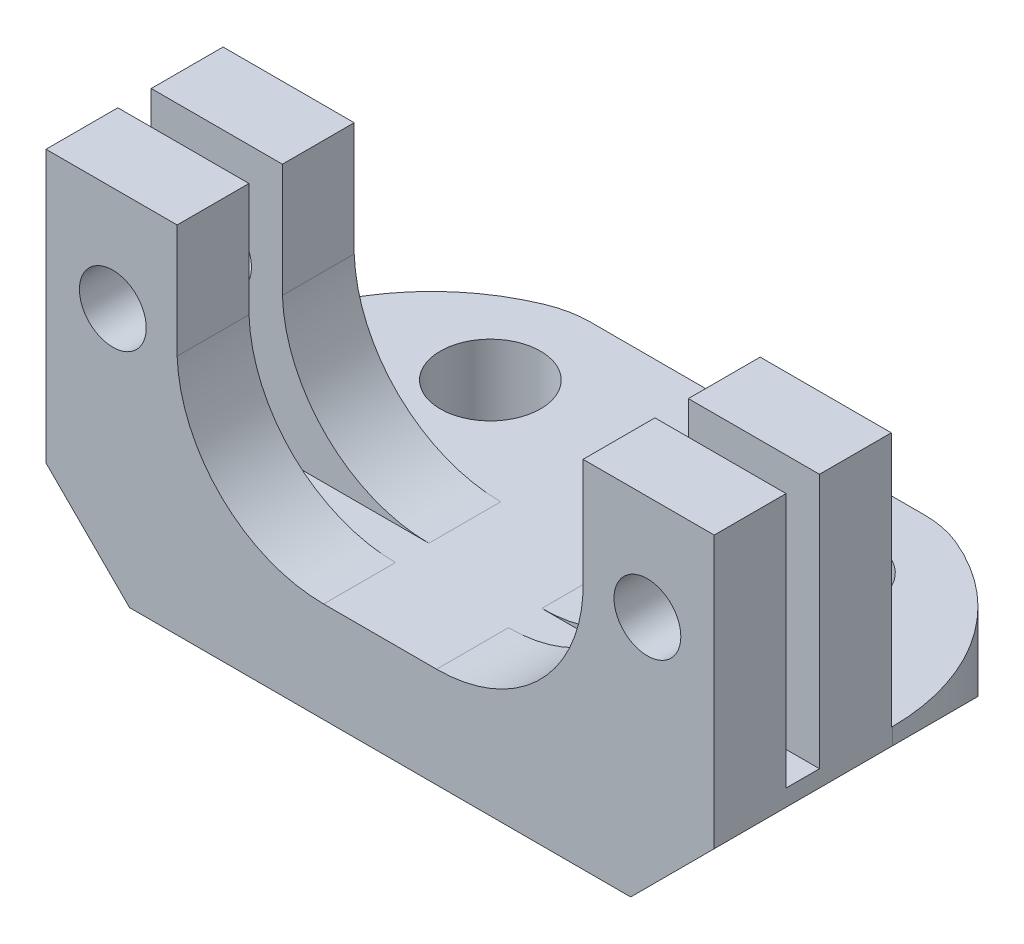
ISO-10303-21;
HEADER;
FILE_DESCRIPTION(('STEP AP214'),'2;1');
FILE_NAME('part.step','',(''),(''),'','','');
FILE_SCHEMA(('AUTOMOTIVE_DESIGN { 1 0 10303 214 1 1 1 1 }'));
ENDSEC;
DATA;
#1=APPLICATION_CONTEXT('core data for automotive mechanical design processes');
#2=APPLICATION_PROTOCOL_DEFINITION('international standard','automotive_design',2000,#1);
#3=PRODUCT_CONTEXT('',#1,'mechanical');
#4=PRODUCT('Part','Part','',(#3));
#5=PRODUCT_RELATED_PRODUCT_CATEGORY('part','',(#4));
#6=PRODUCT_DEFINITION_FORMATION('','',#4);
#7=PRODUCT_DEFINITION_CONTEXT('part definition',#1,'design');
#8=PRODUCT_DEFINITION('design','',#6,#7);
#9=PRODUCT_DEFINITION_SHAPE('','',#8);
#10=(LENGTH_UNIT() NAMED_UNIT(*) SI_UNIT(.MILLI.,.METRE.));
#11=(NAMED_UNIT(*) PLANE_ANGLE_UNIT() SI_UNIT($,.RADIAN.));
#12=(NAMED_UNIT(*) SI_UNIT($,.STERADIAN.) SOLID_ANGLE_UNIT());
#13=UNCERTAINTY_MEASURE_WITH_UNIT(LENGTH_MEASURE(1.E-05),#10,'distance_accuracy_value','');
#14=(GEOMETRIC_REPRESENTATION_CONTEXT(3) GLOBAL_UNCERTAINTY_ASSIGNED_CONTEXT((#13)) GLOBAL_UNIT_ASSIGNED_CONTEXT((#10,
#11,#12)) REPRESENTATION_CONTEXT('',''));
#15=CARTESIAN_POINT('',(0.,0.,0.));
#16=DIRECTION('',(0.,0.,1.));
#17=DIRECTION('',(1.,0.,0.));
#18=AXIS2_PLACEMENT_3D('',#15,#16,#17);
#19=CARTESIAN_POINT('',(-10.,10.6321180984836,5.3));
#20=DIRECTION('',(1.,0.,0.));
#21=DIRECTION('',(0.,0.,-1.));
#22=AXIS2_PLACEMENT_3D('',#19,#20,#21);
#23=PLANE('',#22);
#24=DIRECTION('',(0.,1.,0.));
#25=VECTOR('',#24,1.);
#26=CARTESIAN_POINT('',(-10.,0.,-0.0310658483845676));
#27=LINE('',#26,#25);
#28=CARTESIAN_POINT('',(-10.,2.5,-0.0310658483845676));
#29=VERTEX_POINT('',#28);
#30=CARTESIAN_POINT('',(-10.,3.,-0.0310658483845676));
#31=VERTEX_POINT('',#30);
#32=EDGE_CURVE('E237',#29,#31,#27,.T.);
#33=ORIENTED_EDGE('',*,*,#32,.F.);
#34=DIRECTION('',(0.,0.,-1.));
#35=VECTOR('',#34,1.);
#36=CARTESIAN_POINT('',(-10.,2.5,5.3));
#37=LINE('',#36,#35);
#38=CARTESIAN_POINT('',(-10.,2.5,5.3));
#39=VERTEX_POINT('',#38);
#40=EDGE_CURVE('E396',#39,#29,#37,.T.);
#41=ORIENTED_EDGE('',*,*,#40,.F.);
#42=DIRECTION('',(0.,-1.,0.));
#43=VECTOR('',#42,1.);
#44=CARTESIAN_POINT('',(-10.,10.6321180984836,5.3));
#45=LINE('',#44,#43);
#46=CARTESIAN_POINT('',(-10.,10.6321180984836,5.3));
#47=VERTEX_POINT('',#46);
#48=EDGE_CURVE('E393',#47,#39,#45,.T.);
#49=ORIENTED_EDGE('',*,*,#48,.F.);
#50=DIRECTION('',(0.,0.,-1.));
#51=VECTOR('',#50,1.);
#52=CARTESIAN_POINT('',(-10.,10.6321180984836,5.3));
#53=LINE('',#52,#51);
#54=CARTESIAN_POINT('',(-10.,10.6321180984836,3.15));
#55=VERTEX_POINT('',#54);
#56=EDGE_CURVE('E423',#47,#55,#53,.T.);
#57=ORIENTED_EDGE('',*,*,#56,.T.);
#58=DIRECTION('',(0.,-1.,0.));
#59=VECTOR('',#58,1.);
#60=CARTESIAN_POINT('',(-10.,3.,3.15));
#61=LINE('',#60,#59);
#62=CARTESIAN_POINT('',(-10.,3.,3.15));
#63=VERTEX_POINT('',#62);
#64=EDGE_CURVE('E299',#55,#63,#61,.T.);
#65=ORIENTED_EDGE('',*,*,#64,.T.);
#66=DIRECTION('',(0.,0.,-1.));
#67=VECTOR('',#66,1.);
#68=CARTESIAN_POINT('',(-10.,3.,3.15));
#69=LINE('',#68,#67);
#70=CARTESIAN_POINT('',(-10.,3.,2.15));
#71=VERTEX_POINT('',#70);
#72=EDGE_CURVE('E298',#63,#71,#69,.T.);
#73=ORIENTED_EDGE('',*,*,#72,.T.);
#74=DIRECTION('',(0.,1.,0.));
#75=VECTOR('',#74,1.);
#76=CARTESIAN_POINT('',(-10.,3.,2.15));
#77=LINE('',#76,#75);
#78=CARTESIAN_POINT('',(-10.,10.6321180984836,2.15));
#79=VERTEX_POINT('',#78);
#80=EDGE_CURVE('E302',#71,#79,#77,.T.);
#81=ORIENTED_EDGE('',*,*,#80,.T.);
#82=CARTESIAN_POINT('',(-10.,10.6321180984836,0.));
#83=VERTEX_POINT('',#82);
#84=EDGE_CURVE('E419',#79,#83,#53,.T.);
#85=ORIENTED_EDGE('',*,*,#84,.T.);
#86=DIRECTION('',(0.,-1.,0.));
#87=VECTOR('',#86,1.);
#88=CARTESIAN_POINT('',(-10.,10.6321180984836,0.));
#89=LINE('',#88,#87);
#90=CARTESIAN_POINT('',(-10.,3.,0.));
#91=VERTEX_POINT('',#90);
#92=EDGE_CURVE('E372',#83,#91,#89,.T.);
#93=ORIENTED_EDGE('',*,*,#92,.T.);
#94=DIRECTION('',(0.,0.,1.));
#95=VECTOR('',#94,1.);
#96=CARTESIAN_POINT('',(-10.,3.,-6.));
#97=LINE('',#96,#95);
#98=EDGE_CURVE('E291',#31,#91,#97,.T.);
#99=ORIENTED_EDGE('',*,*,#98,.F.);
#100=EDGE_LOOP('',(#33,#41,#49,#57,#65,#73,#81,#85,#93,#99));
#101=FACE_BOUND('',#100,.T.);
#102=ADVANCED_FACE('F39',(#101),#23,.F.);
#103=CARTESIAN_POINT('',(-7.50000000000003,0.,5.3));
#104=DIRECTION('',(0.,1.,0.));
#105=DIRECTION('',(0.,0.,1.));
#106=AXIS2_PLACEMENT_3D('',#103,#104,#105);
#107=PLANE('',#106);
#108=CARTESIAN_POINT('',(-5.,0.,-3.));
#109=DIRECTION('',(0.,1.,0.));
#110=DIRECTION('',(0.,0.,1.));
#111=AXIS2_PLACEMENT_3D('',#108,#109,#110);
#112=CIRCLE('',#111,1.5);
#113=CARTESIAN_POINT('',(-5.,0.,-1.5));
#114=VERTEX_POINT('',#113);
#115=EDGE_CURVE('E273',#114,#114,#112,.T.);
#116=ORIENTED_EDGE('',*,*,#115,.T.);
#117=EDGE_LOOP('',(#116));
#118=FACE_BOUND('',#117,.T.);
#119=CARTESIAN_POINT('',(5.,0.,-3.));
#120=DIRECTION('',(0.,1.,0.));
#121=DIRECTION('',(0.,0.,-1.));
#122=AXIS2_PLACEMENT_3D('',#119,#120,#121);
#123=CIRCLE('',#122,1.5);
#124=CARTESIAN_POINT('',(5.,0.,-4.5));
#125=VERTEX_POINT('',#124);
#126=EDGE_CURVE('E272',#125,#125,#123,.T.);
#127=ORIENTED_EDGE('',*,*,#126,.T.);
#128=EDGE_LOOP('',(#127));
#129=FACE_BOUND('',#128,.T.);
#130=CARTESIAN_POINT('',(-5.,0.,-3.));
#131=DIRECTION('',(0.,1.,0.));
#132=DIRECTION('',(0.,0.,1.));
#133=AXIS2_PLACEMENT_3D('',#130,#131,#132);
#134=CIRCLE('',#133,3.);
#135=CARTESIAN_POINT('',(-5.,0.,-6.));
#136=VERTEX_POINT('',#135);
#137=CARTESIAN_POINT('',(-6.14052533008233,0.,-5.77474358661131));
#138=VERTEX_POINT('',#137);
#139=EDGE_CURVE('E226',#136,#138,#134,.T.);
#140=ORIENTED_EDGE('',*,*,#139,.F.);
#141=DIRECTION('',(-1.,0.,0.));
#142=VECTOR('',#141,1.);
#143=CARTESIAN_POINT('',(0.,0.,-6.));
#144=LINE('',#143,#142);
#145=CARTESIAN_POINT('',(5.,0.,-6.));
#146=VERTEX_POINT('',#145);
#147=EDGE_CURVE('E287',#146,#136,#144,.T.);
#148=ORIENTED_EDGE('',*,*,#147,.F.);
#149=CARTESIAN_POINT('',(5.,0.,-3.));
#150=DIRECTION('',(0.,1.,0.));
#151=DIRECTION('',(0.,0.,1.));
#152=AXIS2_PLACEMENT_3D('',#149,#150,#151);
#153=CIRCLE('',#152,3.);
#154=CARTESIAN_POINT('',(6.14052533008233,0.,-5.77474358661131));
#155=VERTEX_POINT('',#154);
#156=EDGE_CURVE('E260',#155,#146,#153,.T.);
#157=ORIENTED_EDGE('',*,*,#156,.F.);
#158=CARTESIAN_POINT('',(3.77327032552495,0.,-0.0155329241923099));
#159=DIRECTION('',(0.,1.,0.));
#160=DIRECTION('',(0.,0.,1.));
#161=AXIS2_PLACEMENT_3D('',#158,#159,#160);
#162=CIRCLE('',#161,6.22674904831748);
#163=CARTESIAN_POINT('',(7.50000000000003,0.,-5.00390837559024));
#164=VERTEX_POINT('',#163);
#165=EDGE_CURVE('E254',#164,#155,#162,.T.);
#166=ORIENTED_EDGE('',*,*,#165,.F.);
#167=DIRECTION('',(0.,0.,-1.));
#168=VECTOR('',#167,1.);
#169=CARTESIAN_POINT('',(7.50000000000003,0.,5.3));
#170=LINE('',#169,#168);
#171=CARTESIAN_POINT('',(7.50000000000003,0.,5.3));
#172=VERTEX_POINT('',#171);
#173=EDGE_CURVE('E454',#172,#164,#170,.T.);
#174=ORIENTED_EDGE('',*,*,#173,.F.);
#175=DIRECTION('',(1.,0.,0.));
#176=VECTOR('',#175,1.);
#177=CARTESIAN_POINT('',(-7.50000000000003,0.,5.3));
#178=LINE('',#177,#176);
#179=CARTESIAN_POINT('',(-7.50000000000003,0.,5.3));
#180=VERTEX_POINT('',#179);
#181=EDGE_CURVE('E373',#180,#172,#178,.T.);
#182=ORIENTED_EDGE('',*,*,#181,.F.);
#183=DIRECTION('',(0.,0.,-1.));
#184=VECTOR('',#183,1.);
#185=CARTESIAN_POINT('',(-7.50000000000003,0.,5.3));
#186=LINE('',#185,#184);
#187=CARTESIAN_POINT('',(-7.50000000000003,0.,-5.00390837559024));
#188=VERTEX_POINT('',#187);
#189=EDGE_CURVE('E48',#180,#188,#186,.T.);
#190=ORIENTED_EDGE('',*,*,#189,.T.);
#191=CARTESIAN_POINT('',(-3.77327032552495,0.,-0.0155329241923099));
#192=DIRECTION('',(0.,1.,0.));
#193=DIRECTION('',(0.,0.,1.));
#194=AXIS2_PLACEMENT_3D('',#191,#192,#193);
#195=CIRCLE('',#194,6.22674904831748);
#196=EDGE_CURVE('E60',#188,#138,#195,.F.);
#197=ORIENTED_EDGE('',*,*,#196,.T.);
#198=EDGE_LOOP('',(#140,#148,#157,#166,#174,#182,#190,#197));
#199=FACE_BOUND('',#198,.T.);
#200=ADVANCED_FACE('F243',(#118,#129,#199),#107,.F.);
#201=CARTESIAN_POINT('',(7.50000000000003,0.,5.3));
#202=DIRECTION('',(-0.707106781186549,0.707106781186546,0.));
#203=DIRECTION('',(-0.707106781186546,-0.707106781186549,0.));
#204=AXIS2_PLACEMENT_3D('',#201,#202,#203);
#205=PLANE('',#204);
#206=CARTESIAN_POINT('',(3.77327032552495,-3.72672967447509,-0.0155329241923099));
#207=DIRECTION('',(-0.707106781186549,0.707106781186546,0.));
#208=DIRECTION('',(0.707106781186546,0.707106781186549,0.));
#209=AXIS2_PLACEMENT_3D('',#206,#207,#208);
#210=ELLIPSE('',#209,8.80595295362435,6.22674904831748);
#211=CARTESIAN_POINT('',(10.,2.50000000000001,-0.0310658483869174));
#212=VERTEX_POINT('',#211);
#213=EDGE_CURVE('E252',#212,#164,#210,.T.);
#214=ORIENTED_EDGE('',*,*,#213,.F.);
#215=DIRECTION('',(0.,0.,-1.));
#216=VECTOR('',#215,1.);
#217=CARTESIAN_POINT('',(10.,2.50000000000001,5.3));
#218=LINE('',#217,#216);
#219=CARTESIAN_POINT('',(10.,2.50000000000001,5.3));
#220=VERTEX_POINT('',#219);
#221=EDGE_CURVE('E455',#220,#212,#218,.T.);
#222=ORIENTED_EDGE('',*,*,#221,.F.);
#223=DIRECTION('',(0.707106781186546,0.707106781186549,0.));
#224=VECTOR('',#223,1.);
#225=CARTESIAN_POINT('',(7.50000000000003,0.,5.3));
#226=LINE('',#225,#224);
#227=EDGE_CURVE('E376',#172,#220,#226,.T.);
#228=ORIENTED_EDGE('',*,*,#227,.F.);
#229=ORIENTED_EDGE('',*,*,#173,.T.);
#230=EDGE_LOOP('',(#214,#222,#228,#229));
#231=FACE_BOUND('',#230,.T.);
#232=ADVANCED_FACE('F568',(#231),#205,.F.);
#233=CARTESIAN_POINT('',(1.68949167081497,3.,5.3));
#234=DIRECTION('',(0.,-1.,0.));
#235=DIRECTION('',(0.,0.,-1.));
#236=AXIS2_PLACEMENT_3D('',#233,#234,#235);
#237=PLANE('',#236);
#238=CARTESIAN_POINT('',(5.,3.,-3.));
#239=DIRECTION('',(0.,1.,0.));
#240=DIRECTION('',(0.,0.,-1.));
#241=AXIS2_PLACEMENT_3D('',#238,#239,#240);
#242=CIRCLE('',#241,1.5);
#243=CARTESIAN_POINT('',(5.,3.,-4.5));
#244=VERTEX_POINT('',#243);
#245=EDGE_CURVE('E278',#244,#244,#242,.T.);
#246=ORIENTED_EDGE('',*,*,#245,.F.);
#247=EDGE_LOOP('',(#246));
#248=FACE_BOUND('',#247,.T.);
#249=CARTESIAN_POINT('',(-5.,3.,-3.));
#250=DIRECTION('',(0.,1.,0.));
#251=DIRECTION('',(0.,0.,1.));
#252=AXIS2_PLACEMENT_3D('',#249,#250,#251);
#253=CIRCLE('',#252,1.5);
#254=CARTESIAN_POINT('',(-5.,3.,-1.5));
#255=VERTEX_POINT('',#254);
#256=EDGE_CURVE('E280',#255,#255,#253,.T.);
#257=ORIENTED_EDGE('',*,*,#256,.F.);
#258=EDGE_LOOP('',(#257));
#259=FACE_BOUND('',#258,.T.);
#260=CARTESIAN_POINT('',(-3.77327032552495,3.,-0.0155329241923099));
#261=DIRECTION('',(0.,1.,0.));
#262=DIRECTION('',(0.,0.,1.));
#263=AXIS2_PLACEMENT_3D('',#260,#261,#262);
#264=CIRCLE('',#263,6.22674904831748);
#265=CARTESIAN_POINT('',(-6.14052533008233,3.,-5.77474358661131));
#266=VERTEX_POINT('',#265);
#267=EDGE_CURVE('E238',#31,#266,#264,.F.);
#268=ORIENTED_EDGE('',*,*,#267,.F.);
#269=ORIENTED_EDGE('',*,*,#98,.T.);
#270=DIRECTION('',(1.,0.,0.));
#271=VECTOR('',#270,1.);
#272=CARTESIAN_POINT('',(0.,3.,0.));
#273=LINE('',#272,#271);
#274=CARTESIAN_POINT('',(-1.68945881939903,3.,0.));
#275=VERTEX_POINT('',#274);
#276=EDGE_CURVE('E49',#91,#275,#273,.T.);
#277=ORIENTED_EDGE('',*,*,#276,.T.);
#278=DIRECTION('',(0.,0.,-1.));
#279=VECTOR('',#278,1.);
#280=CARTESIAN_POINT('',(-1.68945881939903,3.,5.3));
#281=LINE('',#280,#279);
#282=CARTESIAN_POINT('',(-1.68945881939904,3.,2.15));
#283=VERTEX_POINT('',#282);
#284=EDGE_CURVE('E435',#283,#275,#281,.T.);
#285=ORIENTED_EDGE('',*,*,#284,.F.);
#286=DIRECTION('',(1.,0.,0.));
#287=VECTOR('',#286,1.);
#288=CARTESIAN_POINT('',(-10.,3.,2.15));
#289=LINE('',#288,#287);
#290=EDGE_CURVE('E321',#71,#283,#289,.T.);
#291=ORIENTED_EDGE('',*,*,#290,.F.);
#292=ORIENTED_EDGE('',*,*,#72,.F.);
#293=DIRECTION('',(1.,0.,0.));
#294=VECTOR('',#293,1.);
#295=CARTESIAN_POINT('',(-10.,3.,3.15));
#296=LINE('',#295,#294);
#297=CARTESIAN_POINT('',(-1.68945881939904,3.,3.15));
#298=VERTEX_POINT('',#297);
#299=EDGE_CURVE('E322',#63,#298,#296,.T.);
#300=ORIENTED_EDGE('',*,*,#299,.T.);
#301=CARTESIAN_POINT('',(-1.68945881939903,3.,5.3));
#302=VERTEX_POINT('',#301);
#303=EDGE_CURVE('E433',#302,#298,#281,.T.);
#304=ORIENTED_EDGE('',*,*,#303,.F.);
#305=DIRECTION('',(-1.,0.,0.));
#306=VECTOR('',#305,1.);
#307=CARTESIAN_POINT('',(1.68949167081497,3.,5.3));
#308=LINE('',#307,#306);
#309=CARTESIAN_POINT('',(1.68949167081497,3.,5.3));
#310=VERTEX_POINT('',#309);
#311=EDGE_CURVE('E387',#310,#302,#308,.T.);
#312=ORIENTED_EDGE('',*,*,#311,.F.);
#313=DIRECTION('',(0.,0.,-1.));
#314=VECTOR('',#313,1.);
#315=CARTESIAN_POINT('',(1.68949167081497,3.,5.3));
#316=LINE('',#315,#314);
#317=CARTESIAN_POINT('',(1.68949167081497,3.,3.15));
#318=VERTEX_POINT('',#317);
#319=EDGE_CURVE('E440',#310,#318,#316,.T.);
#320=ORIENTED_EDGE('',*,*,#319,.T.);
#321=CARTESIAN_POINT('',(10.,3.,3.15));
#322=VERTEX_POINT('',#321);
#323=EDGE_CURVE('E308',#318,#322,#296,.T.);
#324=ORIENTED_EDGE('',*,*,#323,.T.);
#325=DIRECTION('',(0.,0.,-1.));
#326=VECTOR('',#325,1.);
#327=CARTESIAN_POINT('',(10.,3.,3.15));
#328=LINE('',#327,#326);
#329=CARTESIAN_POINT('',(10.,3.,2.15));
#330=VERTEX_POINT('',#329);
#331=EDGE_CURVE('E310',#322,#330,#328,.T.);
#332=ORIENTED_EDGE('',*,*,#331,.T.);
#333=CARTESIAN_POINT('',(1.68949167081497,3.,2.15));
#334=VERTEX_POINT('',#333);
#335=EDGE_CURVE('E323',#334,#330,#289,.T.);
#336=ORIENTED_EDGE('',*,*,#335,.F.);
#337=CARTESIAN_POINT('',(1.68949167081497,3.,0.));
#338=VERTEX_POINT('',#337);
#339=EDGE_CURVE('E436',#334,#338,#316,.T.);
#340=ORIENTED_EDGE('',*,*,#339,.T.);
#341=CARTESIAN_POINT('',(10.,3.,0.));
#342=VERTEX_POINT('',#341);
#343=EDGE_CURVE('E11',#338,#342,#273,.T.);
#344=ORIENTED_EDGE('',*,*,#343,.T.);
#345=DIRECTION('',(0.,0.,1.));
#346=VECTOR('',#345,1.);
#347=CARTESIAN_POINT('',(10.,3.,-6.));
#348=LINE('',#347,#346);
#349=CARTESIAN_POINT('',(10.,3.,-0.0310658483871851));
#350=VERTEX_POINT('',#349);
#351=EDGE_CURVE('E288',#350,#342,#348,.T.);
#352=ORIENTED_EDGE('',*,*,#351,.F.);
#353=CARTESIAN_POINT('',(3.77327032552495,3.,-0.0155329241923099));
#354=DIRECTION('',(0.,1.,0.));
#355=DIRECTION('',(0.,0.,1.));
#356=AXIS2_PLACEMENT_3D('',#353,#354,#355);
#357=CIRCLE('',#356,6.22674904831748);
#358=CARTESIAN_POINT('',(6.14052533008233,3.,-5.77474358661131));
#359=VERTEX_POINT('',#358);
#360=EDGE_CURVE('E257',#350,#359,#357,.T.);
#361=ORIENTED_EDGE('',*,*,#360,.T.);
#362=CARTESIAN_POINT('',(5.,3.,-3.));
#363=DIRECTION('',(0.,1.,0.));
#364=DIRECTION('',(0.,0.,1.));
#365=AXIS2_PLACEMENT_3D('',#362,#363,#364);
#366=CIRCLE('',#365,3.);
#367=CARTESIAN_POINT('',(5.,3.,-6.));
#368=VERTEX_POINT('',#367);
#369=EDGE_CURVE('E256',#359,#368,#366,.T.);
#370=ORIENTED_EDGE('',*,*,#369,.T.);
#371=DIRECTION('',(1.,0.,0.));
#372=VECTOR('',#371,1.);
#373=CARTESIAN_POINT('',(0.,3.,-6.));
#374=LINE('',#373,#372);
#375=CARTESIAN_POINT('',(-5.,3.,-6.));
#376=VERTEX_POINT('',#375);
#377=EDGE_CURVE('E282',#376,#368,#374,.T.);
#378=ORIENTED_EDGE('',*,*,#377,.F.);
#379=CARTESIAN_POINT('',(-5.,3.,-3.));
#380=DIRECTION('',(0.,1.,0.));
#381=DIRECTION('',(0.,0.,1.));
#382=AXIS2_PLACEMENT_3D('',#379,#380,#381);
#383=CIRCLE('',#382,3.);
#384=EDGE_CURVE('E246',#376,#266,#383,.T.);
#385=ORIENTED_EDGE('',*,*,#384,.T.);
#386=EDGE_LOOP('',(#268,#269,#277,#285,#291,#292,#300,#304,#312,#320,#324,#332,#336,#340,#344,
#352,#361,#370,#378,#385));
#387=FACE_BOUND('',#386,.T.);
#388=ADVANCED_FACE('F490',(#248,#259,#387),#237,.F.);
#389=CARTESIAN_POINT('',(0.,0.,-6.));
#390=DIRECTION('',(0.,0.,-1.));
#391=DIRECTION('',(-1.,0.,0.));
#392=AXIS2_PLACEMENT_3D('',#389,#390,#391);
#393=PLANE('',#392);
#394=ORIENTED_EDGE('',*,*,#147,.T.);
#395=DIRECTION('',(0.,1.,0.));
#396=VECTOR('',#395,1.);
#397=CARTESIAN_POINT('',(-5.,0.,-6.));
#398=LINE('',#397,#396);
#399=EDGE_CURVE('E235',#136,#376,#398,.T.);
#400=ORIENTED_EDGE('',*,*,#399,.T.);
#401=ORIENTED_EDGE('',*,*,#377,.T.);
#402=DIRECTION('',(0.,1.,0.));
#403=VECTOR('',#402,1.);
#404=CARTESIAN_POINT('',(5.,0.,-6.));
#405=LINE('',#404,#403);
#406=EDGE_CURVE('E270',#146,#368,#405,.T.);
#407=ORIENTED_EDGE('',*,*,#406,.F.);
#408=EDGE_LOOP('',(#394,#400,#401,#407));
#409=FACE_BOUND('',#408,.T.);
#410=ADVANCED_FACE('F511',(#409),#393,.T.);
#411=CARTESIAN_POINT('',(1.68949167081497,7.38840461932034,0.));
#412=DIRECTION('',(0.,0.,1.));
#413=DIRECTION('',(1.,0.,0.));
#414=AXIS2_PLACEMENT_3D('',#411,#412,#413);
#415=PLANE('',#414);
#416=CARTESIAN_POINT('',(-8.00000000000003,7.5,0.));
#417=DIRECTION('',(0.,0.,1.));
#418=DIRECTION('',(1.,0.,0.));
#419=AXIS2_PLACEMENT_3D('',#416,#417,#418);
#420=CIRCLE('',#419,1.);
#421=CARTESIAN_POINT('',(-7.00000000000002,7.5,0.));
#422=VERTEX_POINT('',#421);
#423=EDGE_CURVE('E363',#422,#422,#420,.T.);
#424=ORIENTED_EDGE('',*,*,#423,.T.);
#425=EDGE_LOOP('',(#424));
#426=FACE_BOUND('',#425,.T.);
#427=ORIENTED_EDGE('',*,*,#276,.F.);
#428=ORIENTED_EDGE('',*,*,#92,.F.);
#429=DIRECTION('',(-1.,0.,0.));
#430=VECTOR('',#429,1.);
#431=CARTESIAN_POINT('',(-6.07500000000003,10.6321180984836,0.));
#432=LINE('',#431,#430);
#433=CARTESIAN_POINT('',(-6.07500000000003,10.6321180984836,0.));
#434=VERTEX_POINT('',#433);
#435=EDGE_CURVE('E412',#434,#83,#432,.T.);
#436=ORIENTED_EDGE('',*,*,#435,.F.);
#437=DIRECTION('',(0.,1.,0.));
#438=VECTOR('',#437,1.);
#439=CARTESIAN_POINT('',(-6.07500000000003,7.23027237386113,0.));
#440=LINE('',#439,#438);
#441=CARTESIAN_POINT('',(-6.07500000000003,7.23027237386113,0.));
#442=VERTEX_POINT('',#441);
#443=EDGE_CURVE('E407',#442,#434,#440,.T.);
#444=ORIENTED_EDGE('',*,*,#443,.F.);
#445=CARTESIAN_POINT('',(-1.68945881939904,7.38839069006703,0.));
#446=DIRECTION('',(0.,0.,-1.));
#447=DIRECTION('',(1.,0.,0.));
#448=AXIS2_PLACEMENT_3D('',#445,#446,#447);
#449=CIRCLE('',#448,4.38839069006703);
#450=EDGE_CURVE('E406',#275,#442,#449,.T.);
#451=ORIENTED_EDGE('',*,*,#450,.F.);
#452=EDGE_LOOP('',(#427,#428,#436,#444,#451));
#453=FACE_BOUND('',#452,.T.);
#454=ADVANCED_FACE('F478',(#426,#453),#415,.F.);
#455=CARTESIAN_POINT('',(7.99999999999997,7.5,0.));
#456=DIRECTION('',(0.,0.,1.));
#457=DIRECTION('',(1.,0.,0.));
#458=AXIS2_PLACEMENT_3D('',#455,#456,#457);
#459=CIRCLE('',#458,1.);
#460=CARTESIAN_POINT('',(8.99999999999997,7.5,0.));
#461=VERTEX_POINT('',#460);
#462=EDGE_CURVE('E360',#461,#461,#459,.T.);
#463=ORIENTED_EDGE('',*,*,#462,.T.);
#464=EDGE_LOOP('',(#463));
#465=FACE_BOUND('',#464,.T.);
#466=ORIENTED_EDGE('',*,*,#343,.F.);
#467=CARTESIAN_POINT('',(1.68949167081497,7.38840461932034,0.));
#468=DIRECTION('',(0.,0.,-1.));
#469=DIRECTION('',(1.,0.,0.));
#470=AXIS2_PLACEMENT_3D('',#467,#468,#469);
#471=CIRCLE('',#470,4.38840461932034);
#472=CARTESIAN_POINT('',(6.07499999999997,7.54781540164402,0.));
#473=VERTEX_POINT('',#472);
#474=EDGE_CURVE('E404',#473,#338,#471,.T.);
#475=ORIENTED_EDGE('',*,*,#474,.F.);
#476=DIRECTION('',(0.,-1.,0.));
#477=VECTOR('',#476,1.);
#478=CARTESIAN_POINT('',(6.07499999999997,10.6321180984836,0.));
#479=LINE('',#478,#477);
#480=CARTESIAN_POINT('',(6.07499999999997,10.6321180984836,0.));
#481=VERTEX_POINT('',#480);
#482=EDGE_CURVE('E402',#481,#473,#479,.T.);
#483=ORIENTED_EDGE('',*,*,#482,.F.);
#484=DIRECTION('',(-1.,0.,0.));
#485=VECTOR('',#484,1.);
#486=CARTESIAN_POINT('',(10.,10.6321180984836,0.));
#487=LINE('',#486,#485);
#488=CARTESIAN_POINT('',(10.,10.6321180984836,0.));
#489=VERTEX_POINT('',#488);
#490=EDGE_CURVE('E397',#489,#481,#487,.T.);
#491=ORIENTED_EDGE('',*,*,#490,.F.);
#492=DIRECTION('',(0.,1.,0.));
#493=VECTOR('',#492,1.);
#494=CARTESIAN_POINT('',(10.,2.50000000000001,0.));
#495=LINE('',#494,#493);
#496=EDGE_CURVE('E370',#342,#489,#495,.T.);
#497=ORIENTED_EDGE('',*,*,#496,.F.);
#498=EDGE_LOOP('',(#466,#475,#483,#491,#497));
#499=FACE_BOUND('',#498,.T.);
#500=ADVANCED_FACE('F472',(#465,#499),#415,.F.);
#501=CARTESIAN_POINT('',(10.,10.6321180984836,5.3));
#502=DIRECTION('',(0.,-1.,0.));
#503=DIRECTION('',(0.,0.,-1.));
#504=AXIS2_PLACEMENT_3D('',#501,#502,#503);
#505=PLANE('',#504);
#506=DIRECTION('',(1.,0.,0.));
#507=VECTOR('',#506,1.);
#508=CARTESIAN_POINT('',(-10.,10.6321180984836,3.15));
#509=LINE('',#508,#507);
#510=CARTESIAN_POINT('',(6.07499999999997,10.6321180984836,3.15));
#511=VERTEX_POINT('',#510);
#512=CARTESIAN_POINT('',(10.,10.6321180984836,3.15));
#513=VERTEX_POINT('',#512);
#514=EDGE_CURVE('E316',#511,#513,#509,.T.);
#515=ORIENTED_EDGE('',*,*,#514,.F.);
#516=DIRECTION('',(0.,0.,-1.));
#517=VECTOR('',#516,1.);
#518=CARTESIAN_POINT('',(6.07499999999997,10.6321180984836,5.3));
#519=LINE('',#518,#517);
#520=CARTESIAN_POINT('',(6.07499999999997,10.6321180984836,5.3));
#521=VERTEX_POINT('',#520);
#522=EDGE_CURVE('E443',#521,#511,#519,.T.);
#523=ORIENTED_EDGE('',*,*,#522,.F.);
#524=DIRECTION('',(-1.,0.,0.));
#525=VECTOR('',#524,1.);
#526=CARTESIAN_POINT('',(10.,10.6321180984836,5.3));
#527=LINE('',#526,#525);
#528=CARTESIAN_POINT('',(10.,10.6321180984836,5.3));
#529=VERTEX_POINT('',#528);
#530=EDGE_CURVE('E379',#529,#521,#527,.T.);
#531=ORIENTED_EDGE('',*,*,#530,.F.);
#532=DIRECTION('',(0.,0.,-1.));
#533=VECTOR('',#532,1.);
#534=CARTESIAN_POINT('',(10.,10.6321180984836,5.3));
#535=LINE('',#534,#533);
#536=EDGE_CURVE('E448',#529,#513,#535,.T.);
#537=ORIENTED_EDGE('',*,*,#536,.T.);
#538=EDGE_LOOP('',(#515,#523,#531,#537));
#539=FACE_BOUND('',#538,.T.);
#540=ADVANCED_FACE('F474',(#539),#505,.F.);
#541=CARTESIAN_POINT('',(-6.07500000000003,10.6321180984836,5.3));
#542=DIRECTION('',(0.,-1.,0.));
#543=DIRECTION('',(0.,0.,-1.));
#544=AXIS2_PLACEMENT_3D('',#541,#542,#543);
#545=PLANE('',#544);
#546=CARTESIAN_POINT('',(-6.07500000000003,10.6321180984836,3.15));
#547=VERTEX_POINT('',#546);
#548=EDGE_CURVE('E311',#55,#547,#509,.T.);
#549=ORIENTED_EDGE('',*,*,#548,.F.);
#550=ORIENTED_EDGE('',*,*,#56,.F.);
#551=DIRECTION('',(-1.,0.,0.));
#552=VECTOR('',#551,1.);
#553=CARTESIAN_POINT('',(-6.07500000000003,10.6321180984836,5.3));
#554=LINE('',#553,#552);
#555=CARTESIAN_POINT('',(-6.07500000000003,10.6321180984836,5.3));
#556=VERTEX_POINT('',#555);
#557=EDGE_CURVE('E391',#556,#47,#554,.T.);
#558=ORIENTED_EDGE('',*,*,#557,.F.);
#559=DIRECTION('',(0.,0.,-1.));
#560=VECTOR('',#559,1.);
#561=CARTESIAN_POINT('',(-6.07500000000003,10.6321180984836,5.3));
#562=LINE('',#561,#560);
#563=EDGE_CURVE('E422',#556,#547,#562,.T.);
#564=ORIENTED_EDGE('',*,*,#563,.T.);
#565=EDGE_LOOP('',(#549,#550,#558,#564));
#566=FACE_BOUND('',#565,.T.);
#567=ADVANCED_FACE('F577',(#566),#545,.F.);
#568=CARTESIAN_POINT('',(10.,2.50000000000001,5.3));
#569=DIRECTION('',(-1.,0.,0.));
#570=DIRECTION('',(0.,0.,1.));
#571=AXIS2_PLACEMENT_3D('',#568,#569,#570);
#572=PLANE('',#571);
#573=ORIENTED_EDGE('',*,*,#221,.T.);
#574=DIRECTION('',(0.,1.,0.));
#575=VECTOR('',#574,1.);
#576=CARTESIAN_POINT('',(10.,0.,-0.0310658483871851));
#577=LINE('',#576,#575);
#578=EDGE_CURVE('E62',#212,#350,#577,.T.);
#579=ORIENTED_EDGE('',*,*,#578,.T.);
#580=ORIENTED_EDGE('',*,*,#351,.T.);
#581=ORIENTED_EDGE('',*,*,#496,.T.);
#582=CARTESIAN_POINT('',(10.,10.6321180984836,2.15));
#583=VERTEX_POINT('',#582);
#584=EDGE_CURVE('E450',#583,#489,#535,.T.);
#585=ORIENTED_EDGE('',*,*,#584,.F.);
#586=DIRECTION('',(0.,1.,0.));
#587=VECTOR('',#586,1.);
#588=CARTESIAN_POINT('',(10.,3.,2.15));
#589=LINE('',#588,#587);
#590=EDGE_CURVE('E297',#330,#583,#589,.T.);
#591=ORIENTED_EDGE('',*,*,#590,.F.);
#592=ORIENTED_EDGE('',*,*,#331,.F.);
#593=DIRECTION('',(0.,-1.,0.));
#594=VECTOR('',#593,1.);
#595=CARTESIAN_POINT('',(10.,3.,3.15));
#596=LINE('',#595,#594);
#597=EDGE_CURVE('E293',#513,#322,#596,.T.);
#598=ORIENTED_EDGE('',*,*,#597,.F.);
#599=ORIENTED_EDGE('',*,*,#536,.F.);
#600=DIRECTION('',(0.,1.,0.));
#601=VECTOR('',#600,1.);
#602=CARTESIAN_POINT('',(10.,2.50000000000001,5.3));
#603=LINE('',#602,#601);
#604=EDGE_CURVE('E378',#220,#529,#603,.T.);
#605=ORIENTED_EDGE('',*,*,#604,.F.);
#606=EDGE_LOOP('',(#573,#579,#580,#581,#585,#591,#592,#598,#599,#605));
#607=FACE_BOUND('',#606,.T.);
#608=ADVANCED_FACE('F504',(#607),#572,.F.);
#609=CARTESIAN_POINT('',(6.07499999999997,10.6321180984836,5.3));
#610=DIRECTION('',(1.,0.,0.));
#611=DIRECTION('',(0.,0.,-1.));
#612=AXIS2_PLACEMENT_3D('',#609,#610,#611);
#613=PLANE('',#612);
#614=ORIENTED_EDGE('',*,*,#522,.T.);
#615=DIRECTION('',(0.,-1.,0.));
#616=VECTOR('',#615,1.);
#617=CARTESIAN_POINT('',(6.07499999999997,10.6321180984836,3.15));
#618=LINE('',#617,#616);
#619=CARTESIAN_POINT('',(6.07499999999997,7.54781540164402,3.15));
#620=VERTEX_POINT('',#619);
#621=EDGE_CURVE('E353',#511,#620,#618,.T.);
#622=ORIENTED_EDGE('',*,*,#621,.T.);
#623=DIRECTION('',(0.,0.,-1.));
#624=VECTOR('',#623,1.);
#625=CARTESIAN_POINT('',(6.07499999999997,7.54781540164402,5.3));
#626=LINE('',#625,#624);
#627=CARTESIAN_POINT('',(6.07499999999997,7.54781540164402,5.3));
#628=VERTEX_POINT('',#627);
#629=EDGE_CURVE('E442',#628,#620,#626,.T.);
#630=ORIENTED_EDGE('',*,*,#629,.F.);
#631=DIRECTION('',(0.,-1.,0.));
#632=VECTOR('',#631,1.);
#633=CARTESIAN_POINT('',(6.07499999999997,10.6321180984836,5.3));
#634=LINE('',#633,#632);
#635=EDGE_CURVE('E385',#521,#628,#634,.T.);
#636=ORIENTED_EDGE('',*,*,#635,.F.);
#637=EDGE_LOOP('',(#614,#622,#630,#636));
#638=FACE_BOUND('',#637,.T.);
#639=ADVANCED_FACE('F558',(#638),#613,.F.);
#640=CARTESIAN_POINT('',(1.68949167081497,7.38840461932034,5.3));
#641=DIRECTION('',(0.,0.,-1.));
#642=DIRECTION('',(-1.,0.,0.));
#643=AXIS2_PLACEMENT_3D('',#640,#641,#642);
#644=CYLINDRICAL_SURFACE('',#643,4.38840461932034);
#645=ORIENTED_EDGE('',*,*,#629,.T.);
#646=CARTESIAN_POINT('',(1.68949167081497,7.38840461932034,3.15));
#647=DIRECTION('',(0.,0.,1.));
#648=DIRECTION('',(1.,0.,0.));
#649=AXIS2_PLACEMENT_3D('',#646,#647,#648);
#650=CIRCLE('',#649,4.38840461932034);
#651=EDGE_CURVE('E354',#620,#318,#650,.F.);
#652=ORIENTED_EDGE('',*,*,#651,.T.);
#653=ORIENTED_EDGE('',*,*,#319,.F.);
#654=CARTESIAN_POINT('',(1.68949167081497,7.38840461932034,5.3));
#655=DIRECTION('',(0.,0.,-1.));
#656=DIRECTION('',(1.,0.,0.));
#657=AXIS2_PLACEMENT_3D('',#654,#655,#656);
#658=CIRCLE('',#657,4.38840461932034);
#659=EDGE_CURVE('E383',#628,#310,#658,.T.);
#660=ORIENTED_EDGE('',*,*,#659,.F.);
#661=EDGE_LOOP('',(#645,#652,#653,#660));
#662=FACE_BOUND('',#661,.T.);
#663=ADVANCED_FACE('F554',(#662),#644,.F.);
#664=CARTESIAN_POINT('',(-1.68945881939904,7.38839069006703,5.3));
#665=DIRECTION('',(0.,0.,-1.));
#666=DIRECTION('',(-1.,0.,0.));
#667=AXIS2_PLACEMENT_3D('',#664,#665,#666);
#668=CYLINDRICAL_SURFACE('',#667,4.38839069006703);
#669=ORIENTED_EDGE('',*,*,#303,.T.);
#670=CARTESIAN_POINT('',(-1.68945881939904,7.38839069006703,3.15));
#671=DIRECTION('',(0.,0.,1.));
#672=DIRECTION('',(1.,0.,0.));
#673=AXIS2_PLACEMENT_3D('',#670,#671,#672);
#674=CIRCLE('',#673,4.38839069006703);
#675=CARTESIAN_POINT('',(-6.07500000000003,7.23027237386113,3.15));
#676=VERTEX_POINT('',#675);
#677=EDGE_CURVE('E346',#298,#676,#674,.F.);
#678=ORIENTED_EDGE('',*,*,#677,.T.);
#679=DIRECTION('',(0.,0.,-1.));
#680=VECTOR('',#679,1.);
#681=CARTESIAN_POINT('',(-6.07500000000003,7.23027237386113,5.3));
#682=LINE('',#681,#680);
#683=CARTESIAN_POINT('',(-6.07500000000003,7.23027237386113,5.3));
#684=VERTEX_POINT('',#683);
#685=EDGE_CURVE('E427',#684,#676,#682,.T.);
#686=ORIENTED_EDGE('',*,*,#685,.F.);
#687=CARTESIAN_POINT('',(-1.68945881939904,7.38839069006703,5.3));
#688=DIRECTION('',(0.,0.,-1.));
#689=DIRECTION('',(1.,0.,0.));
#690=AXIS2_PLACEMENT_3D('',#687,#688,#689);
#691=CIRCLE('',#690,4.38839069006703);
#692=EDGE_CURVE('E389',#302,#684,#691,.T.);
#693=ORIENTED_EDGE('',*,*,#692,.F.);
#694=EDGE_LOOP('',(#669,#678,#686,#693));
#695=FACE_BOUND('',#694,.T.);
#696=ADVANCED_FACE('F543',(#695),#668,.F.);
#697=CARTESIAN_POINT('',(-6.07500000000003,7.23027237386113,5.3));
#698=DIRECTION('',(-1.,0.,0.));
#699=DIRECTION('',(0.,0.,1.));
#700=AXIS2_PLACEMENT_3D('',#697,#698,#699);
#701=PLANE('',#700);
#702=ORIENTED_EDGE('',*,*,#685,.T.);
#703=DIRECTION('',(0.,1.,0.));
#704=VECTOR('',#703,1.);
#705=CARTESIAN_POINT('',(-6.07500000000003,7.23027237386113,3.15));
#706=LINE('',#705,#704);
#707=EDGE_CURVE('E344',#676,#547,#706,.T.);
#708=ORIENTED_EDGE('',*,*,#707,.T.);
#709=ORIENTED_EDGE('',*,*,#563,.F.);
#710=DIRECTION('',(0.,1.,0.));
#711=VECTOR('',#710,1.);
#712=CARTESIAN_POINT('',(-6.07500000000003,7.23027237386113,5.3));
#713=LINE('',#712,#711);
#714=EDGE_CURVE('E388',#684,#556,#713,.T.);
#715=ORIENTED_EDGE('',*,*,#714,.F.);
#716=EDGE_LOOP('',(#702,#708,#709,#715));
#717=FACE_BOUND('',#716,.T.);
#718=ADVANCED_FACE('F583',(#717),#701,.F.);
#719=CARTESIAN_POINT('',(-8.00000000000003,7.5,5.3));
#720=DIRECTION('',(0.,0.,-1.));
#721=DIRECTION('',(-1.,0.,0.));
#722=AXIS2_PLACEMENT_3D('',#719,#720,#721);
#723=CYLINDRICAL_SURFACE('',#722,1.);
#724=CARTESIAN_POINT('',(-8.00000000000003,7.5,3.15));
#725=DIRECTION('',(0.,0.,1.));
#726=DIRECTION('',(1.,0.,0.));
#727=AXIS2_PLACEMENT_3D('',#724,#725,#726);
#728=CIRCLE('',#727,1.);
#729=CARTESIAN_POINT('',(-7.00000000000002,7.5,3.15));
#730=VERTEX_POINT('',#729);
#731=EDGE_CURVE('E345',#730,#730,#728,.T.);
#732=ORIENTED_EDGE('',*,*,#731,.F.);
#733=EDGE_LOOP('',(#732));
#734=FACE_BOUND('',#733,.T.);
#735=CARTESIAN_POINT('',(-8.00000000000003,7.5,5.3));
#736=DIRECTION('',(0.,0.,1.));
#737=DIRECTION('',(1.,0.,0.));
#738=AXIS2_PLACEMENT_3D('',#735,#736,#737);
#739=CIRCLE('',#738,1.);
#740=CARTESIAN_POINT('',(-7.00000000000002,7.5,5.3));
#741=VERTEX_POINT('',#740);
#742=EDGE_CURVE('E365',#741,#741,#739,.T.);
#743=ORIENTED_EDGE('',*,*,#742,.T.);
#744=EDGE_LOOP('',(#743));
#745=FACE_BOUND('',#744,.T.);
#746=ADVANCED_FACE('F581',(#734,#745),#723,.F.);
#747=CARTESIAN_POINT('',(7.99999999999997,7.5,5.3));
#748=DIRECTION('',(0.,0.,-1.));
#749=DIRECTION('',(-1.,0.,0.));
#750=AXIS2_PLACEMENT_3D('',#747,#748,#749);
#751=CYLINDRICAL_SURFACE('',#750,1.);
#752=CARTESIAN_POINT('',(7.99999999999997,7.5,3.15));
#753=DIRECTION('',(0.,0.,1.));
#754=DIRECTION('',(1.,0.,0.));
#755=AXIS2_PLACEMENT_3D('',#752,#753,#754);
#756=CIRCLE('',#755,1.);
#757=CARTESIAN_POINT('',(8.99999999999997,7.5,3.15));
#758=VERTEX_POINT('',#757);
#759=EDGE_CURVE('E43',#758,#758,#756,.T.);
#760=ORIENTED_EDGE('',*,*,#759,.F.);
#761=EDGE_LOOP('',(#760));
#762=FACE_BOUND('',#761,.T.);
#763=CARTESIAN_POINT('',(7.99999999999997,7.5,5.3));
#764=DIRECTION('',(0.,0.,1.));
#765=DIRECTION('',(1.,0.,0.));
#766=AXIS2_PLACEMENT_3D('',#763,#764,#765);
#767=CIRCLE('',#766,1.);
#768=CARTESIAN_POINT('',(8.99999999999997,7.5,5.3));
#769=VERTEX_POINT('',#768);
#770=EDGE_CURVE('E357',#769,#769,#767,.T.);
#771=ORIENTED_EDGE('',*,*,#770,.T.);
#772=EDGE_LOOP('',(#771));
#773=FACE_BOUND('',#772,.T.);
#774=ADVANCED_FACE('F468',(#762,#773),#751,.F.);
#775=CARTESIAN_POINT('',(1.68949167081497,7.38840461932034,5.3));
#776=DIRECTION('',(0.,0.,1.));
#777=DIRECTION('',(1.,0.,0.));
#778=AXIS2_PLACEMENT_3D('',#775,#776,#777);
#779=PLANE('',#778);
#780=ORIENTED_EDGE('',*,*,#742,.F.);
#781=EDGE_LOOP('',(#780));
#782=FACE_BOUND('',#781,.T.);
#783=DIRECTION('',(0.707106781186549,-0.707106781186546,0.));
#784=VECTOR('',#783,1.);
#785=CARTESIAN_POINT('',(-10.,2.5,5.3));
#786=LINE('',#785,#784);
#787=EDGE_CURVE('E367',#39,#180,#786,.T.);
#788=ORIENTED_EDGE('',*,*,#787,.T.);
#789=ORIENTED_EDGE('',*,*,#181,.T.);
#790=ORIENTED_EDGE('',*,*,#227,.T.);
#791=ORIENTED_EDGE('',*,*,#604,.T.);
#792=ORIENTED_EDGE('',*,*,#530,.T.);
#793=ORIENTED_EDGE('',*,*,#635,.T.);
#794=ORIENTED_EDGE('',*,*,#659,.T.);
#795=ORIENTED_EDGE('',*,*,#311,.T.);
#796=ORIENTED_EDGE('',*,*,#692,.T.);
#797=ORIENTED_EDGE('',*,*,#714,.T.);
#798=ORIENTED_EDGE('',*,*,#557,.T.);
#799=ORIENTED_EDGE('',*,*,#48,.T.);
#800=EDGE_LOOP('',(#788,#789,#790,#791,#792,#793,#794,#795,#796,#797,#798,#799));
#801=FACE_BOUND('',#800,.T.);
#802=ORIENTED_EDGE('',*,*,#770,.F.);
#803=EDGE_LOOP('',(#802));
#804=FACE_BOUND('',#803,.T.);
#805=ADVANCED_FACE('F550',(#782,#801,#804),#779,.T.);
#806=CARTESIAN_POINT('',(-10.,2.5,5.3));
#807=DIRECTION('',(0.707106781186546,0.707106781186549,0.));
#808=DIRECTION('',(-0.707106781186549,0.707106781186546,0.));
#809=AXIS2_PLACEMENT_3D('',#806,#807,#808);
#810=PLANE('',#809);
#811=ORIENTED_EDGE('',*,*,#40,.T.);
#812=CARTESIAN_POINT('',(-3.77327032552495,-3.72672967447507,-0.0155329241923099));
#813=DIRECTION('',(0.707106781186546,0.707106781186549,0.));
#814=DIRECTION('',(-0.707106781186549,0.707106781186546,0.));
#815=AXIS2_PLACEMENT_3D('',#812,#813,#814);
#816=ELLIPSE('',#815,8.80595295362432,6.22674904831748);
#817=EDGE_CURVE('E271',#29,#188,#816,.F.);
#818=ORIENTED_EDGE('',*,*,#817,.T.);
#819=ORIENTED_EDGE('',*,*,#189,.F.);
#820=ORIENTED_EDGE('',*,*,#787,.F.);
#821=EDGE_LOOP('',(#811,#818,#819,#820));
#822=FACE_BOUND('',#821,.T.);
#823=ADVANCED_FACE('F41',(#822),#810,.F.);
#824=CARTESIAN_POINT('',(6.07499999999997,10.6321180984836,2.15));
#825=VERTEX_POINT('',#824);
#826=EDGE_CURVE('E441',#825,#481,#519,.T.);
#827=ORIENTED_EDGE('',*,*,#826,.F.);
#828=DIRECTION('',(1.,0.,0.));
#829=VECTOR('',#828,1.);
#830=CARTESIAN_POINT('',(-10.,10.6321180984836,2.15));
#831=LINE('',#830,#829);
#832=EDGE_CURVE('E319',#825,#583,#831,.T.);
#833=ORIENTED_EDGE('',*,*,#832,.T.);
#834=ORIENTED_EDGE('',*,*,#584,.T.);
#835=ORIENTED_EDGE('',*,*,#490,.T.);
#836=EDGE_LOOP('',(#827,#833,#834,#835));
#837=FACE_BOUND('',#836,.T.);
#838=ADVANCED_FACE('F497',(#837),#505,.F.);
#839=CARTESIAN_POINT('',(6.07499999999997,7.54781540164402,2.15));
#840=VERTEX_POINT('',#839);
#841=EDGE_CURVE('E439',#840,#473,#626,.T.);
#842=ORIENTED_EDGE('',*,*,#841,.F.);
#843=DIRECTION('',(0.,1.,0.));
#844=VECTOR('',#843,1.);
#845=CARTESIAN_POINT('',(6.07499999999997,10.6321180984836,2.15));
#846=LINE('',#845,#844);
#847=EDGE_CURVE('E338',#840,#825,#846,.T.);
#848=ORIENTED_EDGE('',*,*,#847,.T.);
#849=ORIENTED_EDGE('',*,*,#826,.T.);
#850=ORIENTED_EDGE('',*,*,#482,.T.);
#851=EDGE_LOOP('',(#842,#848,#849,#850));
#852=FACE_BOUND('',#851,.T.);
#853=ADVANCED_FACE('F495',(#852),#613,.F.);
#854=ORIENTED_EDGE('',*,*,#339,.F.);
#855=CARTESIAN_POINT('',(1.68949167081497,7.38840461932034,2.15));
#856=DIRECTION('',(0.,0.,-1.));
#857=DIRECTION('',(-1.,0.,0.));
#858=AXIS2_PLACEMENT_3D('',#855,#856,#857);
#859=CIRCLE('',#858,4.38840461932034);
#860=EDGE_CURVE('E339',#334,#840,#859,.F.);
#861=ORIENTED_EDGE('',*,*,#860,.T.);
#862=ORIENTED_EDGE('',*,*,#841,.T.);
#863=ORIENTED_EDGE('',*,*,#474,.T.);
#864=EDGE_LOOP('',(#854,#861,#862,#863));
#865=FACE_BOUND('',#864,.T.);
#866=ADVANCED_FACE('F487',(#865),#644,.F.);
#867=CARTESIAN_POINT('',(-6.07500000000003,7.23027237386113,2.15));
#868=VERTEX_POINT('',#867);
#869=EDGE_CURVE('E428',#868,#442,#682,.T.);
#870=ORIENTED_EDGE('',*,*,#869,.F.);
#871=CARTESIAN_POINT('',(-1.68945881939904,7.38839069006703,2.15));
#872=DIRECTION('',(0.,0.,-1.));
#873=DIRECTION('',(-1.,0.,0.));
#874=AXIS2_PLACEMENT_3D('',#871,#872,#873);
#875=CIRCLE('',#874,4.38839069006703);
#876=EDGE_CURVE('E334',#868,#283,#875,.F.);
#877=ORIENTED_EDGE('',*,*,#876,.T.);
#878=ORIENTED_EDGE('',*,*,#284,.T.);
#879=ORIENTED_EDGE('',*,*,#450,.T.);
#880=EDGE_LOOP('',(#870,#877,#878,#879));
#881=FACE_BOUND('',#880,.T.);
#882=ADVANCED_FACE('F529',(#881),#668,.F.);
#883=CARTESIAN_POINT('',(-6.07500000000003,10.6321180984836,2.15));
#884=VERTEX_POINT('',#883);
#885=EDGE_CURVE('E424',#884,#434,#562,.T.);
#886=ORIENTED_EDGE('',*,*,#885,.F.);
#887=DIRECTION('',(0.,-1.,0.));
#888=VECTOR('',#887,1.);
#889=CARTESIAN_POINT('',(-6.07500000000003,7.23027237386113,2.15));
#890=LINE('',#889,#888);
#891=EDGE_CURVE('E329',#884,#868,#890,.T.);
#892=ORIENTED_EDGE('',*,*,#891,.T.);
#893=ORIENTED_EDGE('',*,*,#869,.T.);
#894=ORIENTED_EDGE('',*,*,#443,.T.);
#895=EDGE_LOOP('',(#886,#892,#893,#894));
#896=FACE_BOUND('',#895,.T.);
#897=ADVANCED_FACE('F532',(#896),#701,.F.);
#898=ORIENTED_EDGE('',*,*,#84,.F.);
#899=EDGE_CURVE('E320',#79,#884,#831,.T.);
#900=ORIENTED_EDGE('',*,*,#899,.T.);
#901=ORIENTED_EDGE('',*,*,#885,.T.);
#902=ORIENTED_EDGE('',*,*,#435,.T.);
#903=EDGE_LOOP('',(#898,#900,#901,#902));
#904=FACE_BOUND('',#903,.T.);
#905=ADVANCED_FACE('F540',(#904),#545,.F.);
#906=CARTESIAN_POINT('',(-8.00000000000003,7.5,2.15));
#907=DIRECTION('',(0.,0.,-1.));
#908=DIRECTION('',(-1.,0.,0.));
#909=AXIS2_PLACEMENT_3D('',#906,#907,#908);
#910=CIRCLE('',#909,1.);
#911=CARTESIAN_POINT('',(-9.00000000000003,7.5,2.15));
#912=VERTEX_POINT('',#911);
#913=EDGE_CURVE('E330',#912,#912,#910,.T.);
#914=ORIENTED_EDGE('',*,*,#913,.F.);
#915=EDGE_LOOP('',(#914));
#916=FACE_BOUND('',#915,.T.);
#917=ORIENTED_EDGE('',*,*,#423,.F.);
#918=EDGE_LOOP('',(#917));
#919=FACE_BOUND('',#918,.T.);
#920=ADVANCED_FACE('F470',(#916,#919),#723,.F.);
#921=CARTESIAN_POINT('',(7.99999999999997,7.5,2.15));
#922=DIRECTION('',(0.,0.,-1.));
#923=DIRECTION('',(-1.,0.,0.));
#924=AXIS2_PLACEMENT_3D('',#921,#922,#923);
#925=CIRCLE('',#924,1.);
#926=CARTESIAN_POINT('',(6.99999999999997,7.5,2.15));
#927=VERTEX_POINT('',#926);
#928=EDGE_CURVE('E312',#927,#927,#925,.T.);
#929=ORIENTED_EDGE('',*,*,#928,.F.);
#930=EDGE_LOOP('',(#929));
#931=FACE_BOUND('',#930,.T.);
#932=ORIENTED_EDGE('',*,*,#462,.F.);
#933=EDGE_LOOP('',(#932));
#934=FACE_BOUND('',#933,.T.);
#935=ADVANCED_FACE('F463',(#931,#934),#751,.F.);
#936=CARTESIAN_POINT('',(-10.,3.,2.15));
#937=DIRECTION('',(0.,0.,-1.));
#938=DIRECTION('',(-1.,0.,0.));
#939=AXIS2_PLACEMENT_3D('',#936,#937,#938);
#940=PLANE('',#939);
#941=ORIENTED_EDGE('',*,*,#928,.T.);
#942=EDGE_LOOP('',(#941));
#943=FACE_BOUND('',#942,.T.);
#944=ORIENTED_EDGE('',*,*,#860,.F.);
#945=ORIENTED_EDGE('',*,*,#335,.T.);
#946=ORIENTED_EDGE('',*,*,#590,.T.);
#947=ORIENTED_EDGE('',*,*,#832,.F.);
#948=ORIENTED_EDGE('',*,*,#847,.F.);
#949=EDGE_LOOP('',(#944,#945,#946,#947,#948));
#950=FACE_BOUND('',#949,.T.);
#951=ADVANCED_FACE('F464',(#943,#950),#940,.F.);
#952=CARTESIAN_POINT('',(-10.,3.,3.15));
#953=DIRECTION('',(0.,0.,1.));
#954=DIRECTION('',(1.,0.,0.));
#955=AXIS2_PLACEMENT_3D('',#952,#953,#954);
#956=PLANE('',#955);
#957=ORIENTED_EDGE('',*,*,#759,.T.);
#958=EDGE_LOOP('',(#957));
#959=FACE_BOUND('',#958,.T.);
#960=ORIENTED_EDGE('',*,*,#514,.T.);
#961=ORIENTED_EDGE('',*,*,#597,.T.);
#962=ORIENTED_EDGE('',*,*,#323,.F.);
#963=ORIENTED_EDGE('',*,*,#651,.F.);
#964=ORIENTED_EDGE('',*,*,#621,.F.);
#965=EDGE_LOOP('',(#960,#961,#962,#963,#964));
#966=FACE_BOUND('',#965,.T.);
#967=ADVANCED_FACE('F559',(#959,#966),#956,.F.);
#968=ORIENTED_EDGE('',*,*,#731,.T.);
#969=EDGE_LOOP('',(#968));
#970=FACE_BOUND('',#969,.T.);
#971=ORIENTED_EDGE('',*,*,#299,.F.);
#972=ORIENTED_EDGE('',*,*,#64,.F.);
#973=ORIENTED_EDGE('',*,*,#548,.T.);
#974=ORIENTED_EDGE('',*,*,#707,.F.);
#975=ORIENTED_EDGE('',*,*,#677,.F.);
#976=EDGE_LOOP('',(#971,#972,#973,#974,#975));
#977=FACE_BOUND('',#976,.T.);
#978=ADVANCED_FACE('F578',(#970,#977),#956,.F.);
#979=ORIENTED_EDGE('',*,*,#913,.T.);
#980=EDGE_LOOP('',(#979));
#981=FACE_BOUND('',#980,.T.);
#982=ORIENTED_EDGE('',*,*,#891,.F.);
#983=ORIENTED_EDGE('',*,*,#899,.F.);
#984=ORIENTED_EDGE('',*,*,#80,.F.);
#985=ORIENTED_EDGE('',*,*,#290,.T.);
#986=ORIENTED_EDGE('',*,*,#876,.F.);
#987=EDGE_LOOP('',(#982,#983,#984,#985,#986));
#988=FACE_BOUND('',#987,.T.);
#989=ADVANCED_FACE('F535',(#981,#988),#940,.F.);
#990=CARTESIAN_POINT('',(5.,0.,-3.));
#991=DIRECTION('',(0.,1.,0.));
#992=DIRECTION('',(0.,0.,1.));
#993=AXIS2_PLACEMENT_3D('',#990,#991,#992);
#994=CYLINDRICAL_SURFACE('',#993,1.5);
#995=ORIENTED_EDGE('',*,*,#126,.F.);
#996=EDGE_LOOP('',(#995));
#997=FACE_BOUND('',#996,.T.);
#998=ORIENTED_EDGE('',*,*,#245,.T.);
#999=EDGE_LOOP('',(#998));
#1000=FACE_BOUND('',#999,.T.);
#1001=ADVANCED_FACE('F643',(#997,#1000),#994,.F.);
#1002=CARTESIAN_POINT('',(-5.,0.,-3.));
#1003=DIRECTION('',(0.,1.,0.));
#1004=DIRECTION('',(0.,0.,1.));
#1005=AXIS2_PLACEMENT_3D('',#1002,#1003,#1004);
#1006=CYLINDRICAL_SURFACE('',#1005,1.5);
#1007=ORIENTED_EDGE('',*,*,#115,.F.);
#1008=EDGE_LOOP('',(#1007));
#1009=FACE_BOUND('',#1008,.T.);
#1010=ORIENTED_EDGE('',*,*,#256,.T.);
#1011=EDGE_LOOP('',(#1010));
#1012=FACE_BOUND('',#1011,.T.);
#1013=ADVANCED_FACE('F644',(#1009,#1012),#1006,.F.);
#1014=CARTESIAN_POINT('',(3.77327032552495,0.,-0.0155329241923099));
#1015=DIRECTION('',(0.,1.,0.));
#1016=DIRECTION('',(0.,0.,1.));
#1017=AXIS2_PLACEMENT_3D('',#1014,#1015,#1016);
#1018=CYLINDRICAL_SURFACE('',#1017,6.22674904831748);
#1019=ORIENTED_EDGE('',*,*,#213,.T.);
#1020=ORIENTED_EDGE('',*,*,#165,.T.);
#1021=DIRECTION('',(0.,1.,0.));
#1022=VECTOR('',#1021,1.);
#1023=CARTESIAN_POINT('',(6.14052533008233,0.,-5.77474358661131));
#1024=LINE('',#1023,#1022);
#1025=EDGE_CURVE('E249',#155,#359,#1024,.T.);
#1026=ORIENTED_EDGE('',*,*,#1025,.T.);
#1027=ORIENTED_EDGE('',*,*,#360,.F.);
#1028=ORIENTED_EDGE('',*,*,#578,.F.);
#1029=EDGE_LOOP('',(#1019,#1020,#1026,#1027,#1028));
#1030=FACE_BOUND('',#1029,.T.);
#1031=ADVANCED_FACE('F503',(#1030),#1018,.T.);
#1032=CARTESIAN_POINT('',(5.,0.,-3.));
#1033=DIRECTION('',(0.,1.,0.));
#1034=DIRECTION('',(0.,0.,1.));
#1035=AXIS2_PLACEMENT_3D('',#1032,#1033,#1034);
#1036=CYLINDRICAL_SURFACE('',#1035,3.);
#1037=ORIENTED_EDGE('',*,*,#369,.F.);
#1038=ORIENTED_EDGE('',*,*,#1025,.F.);
#1039=ORIENTED_EDGE('',*,*,#156,.T.);
#1040=ORIENTED_EDGE('',*,*,#406,.T.);
#1041=EDGE_LOOP('',(#1037,#1038,#1039,#1040));
#1042=FACE_BOUND('',#1041,.T.);
#1043=ADVANCED_FACE('F508',(#1042),#1036,.T.);
#1044=CARTESIAN_POINT('',(-3.77327032552495,0.,-0.0155329241923099));
#1045=DIRECTION('',(0.,1.,0.));
#1046=DIRECTION('',(0.,0.,1.));
#1047=AXIS2_PLACEMENT_3D('',#1044,#1045,#1046);
#1048=CYLINDRICAL_SURFACE('',#1047,6.22674904831748);
#1049=ORIENTED_EDGE('',*,*,#32,.T.);
#1050=ORIENTED_EDGE('',*,*,#267,.T.);
#1051=DIRECTION('',(0.,1.,0.));
#1052=VECTOR('',#1051,1.);
#1053=CARTESIAN_POINT('',(-6.14052533008233,0.,-5.77474358661131));
#1054=LINE('',#1053,#1052);
#1055=EDGE_CURVE('E228',#138,#266,#1054,.T.);
#1056=ORIENTED_EDGE('',*,*,#1055,.F.);
#1057=ORIENTED_EDGE('',*,*,#196,.F.);
#1058=ORIENTED_EDGE('',*,*,#817,.F.);
#1059=EDGE_LOOP('',(#1049,#1050,#1056,#1057,#1058));
#1060=FACE_BOUND('',#1059,.T.);
#1061=ADVANCED_FACE('F236',(#1060),#1048,.T.);
#1062=CARTESIAN_POINT('',(-5.,0.,-3.));
#1063=DIRECTION('',(0.,1.,0.));
#1064=DIRECTION('',(0.,0.,1.));
#1065=AXIS2_PLACEMENT_3D('',#1062,#1063,#1064);
#1066=CYLINDRICAL_SURFACE('',#1065,3.);
#1067=ORIENTED_EDGE('',*,*,#384,.F.);
#1068=ORIENTED_EDGE('',*,*,#399,.F.);
#1069=ORIENTED_EDGE('',*,*,#139,.T.);
#1070=ORIENTED_EDGE('',*,*,#1055,.T.);
#1071=EDGE_LOOP('',(#1067,#1068,#1069,#1070));
#1072=FACE_BOUND('',#1071,.T.);
#1073=ADVANCED_FACE('F230',(#1072),#1066,.T.);
#1074=CLOSED_SHELL('',(#102,#200,#232,#388,#410,#454,#500,#540,#567,#608,#639,#663,#696,#718,
#746,#774,#805,#823,#838,#853,#866,#882,#897,#905,#920,#935,#951,#967,#978,#989,#1001,#1013,
#1031,#1043,#1061,#1073));
#1075=MANIFOLD_SOLID_BREP('B2',#1074);
#1076=ADVANCED_BREP_SHAPE_REPRESENTATION('',(#18,#1075),#14);
#1077=SHAPE_DEFINITION_REPRESENTATION(#9,#1076);
ENDSEC;
END-ISO-10303-21;
